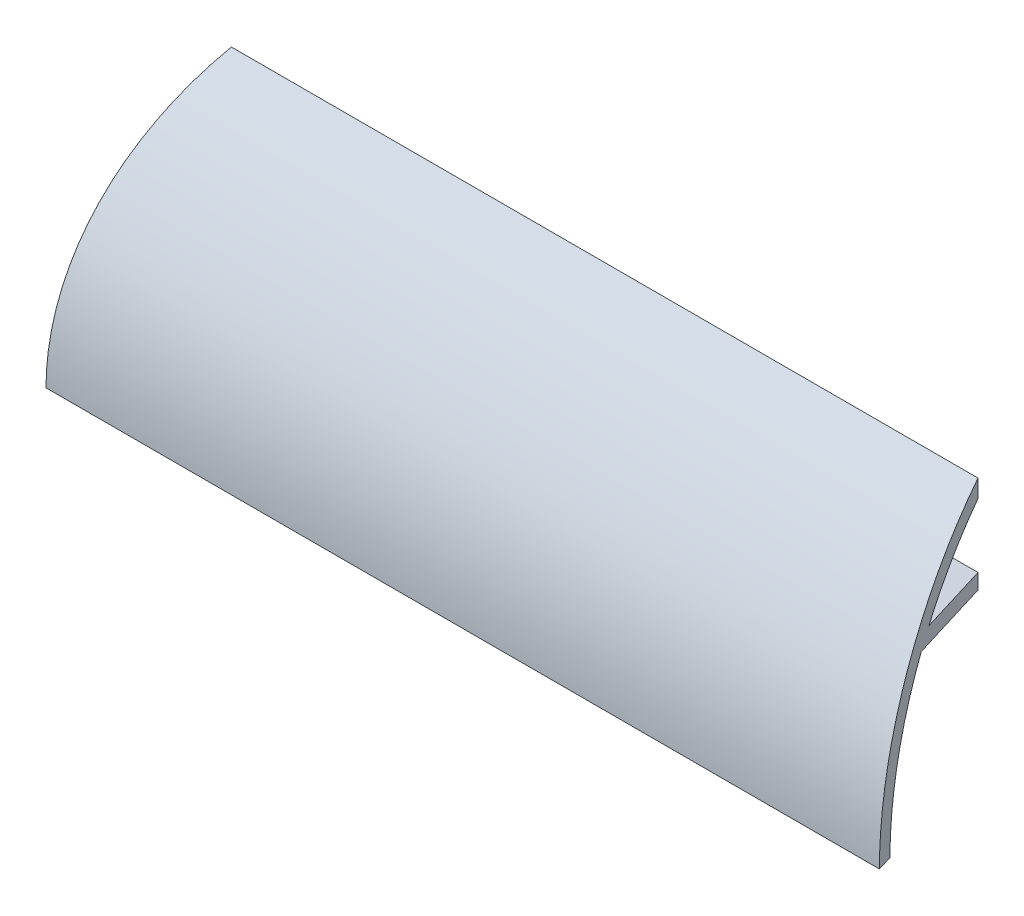
ISO-10303-21;
HEADER;
FILE_DESCRIPTION(('STEP AP214'),'2;1');
FILE_NAME('part.step','',(''),(''),'','','');
FILE_SCHEMA(('AUTOMOTIVE_DESIGN { 1 0 10303 214 1 1 1 1 }'));
ENDSEC;
DATA;
#1=APPLICATION_CONTEXT('core data for automotive mechanical design processes');
#2=APPLICATION_PROTOCOL_DEFINITION('international standard','automotive_design',2000,#1);
#3=PRODUCT_CONTEXT('',#1,'mechanical');
#4=PRODUCT('Part','Part','',(#3));
#5=PRODUCT_RELATED_PRODUCT_CATEGORY('part','',(#4));
#6=PRODUCT_DEFINITION_FORMATION('','',#4);
#7=PRODUCT_DEFINITION_CONTEXT('part definition',#1,'design');
#8=PRODUCT_DEFINITION('design','',#6,#7);
#9=PRODUCT_DEFINITION_SHAPE('','',#8);
#10=(LENGTH_UNIT() NAMED_UNIT(*) SI_UNIT(.MILLI.,.METRE.));
#11=(NAMED_UNIT(*) PLANE_ANGLE_UNIT() SI_UNIT($,.RADIAN.));
#12=(NAMED_UNIT(*) SI_UNIT($,.STERADIAN.) SOLID_ANGLE_UNIT());
#13=UNCERTAINTY_MEASURE_WITH_UNIT(LENGTH_MEASURE(1.E-05),#10,'distance_accuracy_value','');
#14=(GEOMETRIC_REPRESENTATION_CONTEXT(3) GLOBAL_UNCERTAINTY_ASSIGNED_CONTEXT((#13)) GLOBAL_UNIT_ASSIGNED_CONTEXT((#10,
#11,#12)) REPRESENTATION_CONTEXT('',''));
#15=CARTESIAN_POINT('',(0.,0.,0.));
#16=DIRECTION('',(0.,0.,1.));
#17=DIRECTION('',(1.,0.,0.));
#18=AXIS2_PLACEMENT_3D('',#15,#16,#17);
#19=CARTESIAN_POINT('',(13.15,0.,-4.48035714285714));
#20=DIRECTION('',(-1.,0.,0.));
#21=DIRECTION('',(0.,0.,1.));
#22=AXIS2_PLACEMENT_3D('',#19,#20,#21);
#23=CYLINDRICAL_SURFACE('',#22,4.48035714285714);
#24=DIRECTION('',(-1.,0.,0.));
#25=VECTOR('',#24,1.);
#26=CARTESIAN_POINT('',(13.15,3.88,-2.24));
#27=LINE('',#26,#25);
#28=CARTESIAN_POINT('',(12.4651632735326,3.88,-2.24));
#29=VERTEX_POINT('',#28);
#30=CARTESIAN_POINT('',(0.68483672646741,3.88,-2.24));
#31=VERTEX_POINT('',#30);
#32=EDGE_CURVE('E182',#29,#31,#27,.T.);
#33=ORIENTED_EDGE('',*,*,#32,.T.);
#34=CARTESIAN_POINT('',(1.36978264246391,0.,-4.48035714285714));
#35=DIRECTION('',(0.956304755963034,0.,0.292371704722741));
#36=DIRECTION('',(-0.292371704722741,0.,0.956304755963034));
#37=AXIS2_PLACEMENT_3D('',#34,#35,#36);
#38=ELLIPSE('',#37,4.68507253040403,4.48035714285714);
#39=CARTESIAN_POINT('',(0.,0.,0.));
#40=VERTEX_POINT('',#39);
#41=EDGE_CURVE('E121',#31,#40,#38,.T.);
#42=ORIENTED_EDGE('',*,*,#41,.T.);
#43=DIRECTION('',(-1.,0.,0.));
#44=VECTOR('',#43,1.);
#45=CARTESIAN_POINT('',(13.15,0.,0.));
#46=LINE('',#45,#44);
#47=CARTESIAN_POINT('',(13.15,0.,0.));
#48=VERTEX_POINT('',#47);
#49=EDGE_CURVE('E13',#48,#40,#46,.T.);
#50=ORIENTED_EDGE('',*,*,#49,.F.);
#51=CARTESIAN_POINT('',(11.7802173575361,0.,-4.48035714285714));
#52=DIRECTION('',(0.956304755963036,0.,-0.292371704722734));
#53=DIRECTION('',(-0.292371704722734,0.,-0.956304755963036));
#54=AXIS2_PLACEMENT_3D('',#51,#52,#53);
#55=ELLIPSE('',#54,4.68507253040402,4.48035714285714);
#56=EDGE_CURVE('E171',#29,#48,#55,.T.);
#57=ORIENTED_EDGE('',*,*,#56,.F.);
#58=EDGE_LOOP('',(#33,#42,#50,#57));
#59=FACE_BOUND('',#58,.T.);
#60=ADVANCED_FACE('F92',(#59),#23,.T.);
#61=CARTESIAN_POINT('',(13.15,0.,0.));
#62=DIRECTION('',(0.,1.,0.));
#63=DIRECTION('',(0.,0.,1.));
#64=AXIS2_PLACEMENT_3D('',#61,#62,#63);
#65=PLANE('',#64);
#66=ORIENTED_EDGE('',*,*,#49,.T.);
#67=DIRECTION('',(0.292371704722741,0.,-0.956304755963034));
#68=VECTOR('',#67,1.);
#69=CARTESIAN_POINT('',(1.12407796045063,0.,-3.67669334032021));
#70=LINE('',#69,#68);
#71=CARTESIAN_POINT('',(0.0733753635500795,0.,-0.24));
#72=VERTEX_POINT('',#71);
#73=EDGE_CURVE('E193',#40,#72,#70,.T.);
#74=ORIENTED_EDGE('',*,*,#73,.T.);
#75=DIRECTION('',(-1.,0.,0.));
#76=VECTOR('',#75,1.);
#77=CARTESIAN_POINT('',(13.15,0.,-0.24));
#78=LINE('',#77,#76);
#79=CARTESIAN_POINT('',(13.0766246364499,0.,-0.24));
#80=VERTEX_POINT('',#79);
#81=EDGE_CURVE('E100',#80,#72,#78,.T.);
#82=ORIENTED_EDGE('',*,*,#81,.F.);
#83=DIRECTION('',(-0.292371704722734,0.,-0.956304755963036));
#84=VECTOR('',#83,1.);
#85=CARTESIAN_POINT('',(13.15,0.,0.));
#86=LINE('',#85,#84);
#87=EDGE_CURVE('E174',#48,#80,#86,.T.);
#88=ORIENTED_EDGE('',*,*,#87,.F.);
#89=EDGE_LOOP('',(#66,#74,#82,#88));
#90=FACE_BOUND('',#89,.T.);
#91=ADVANCED_FACE('F186',(#90),#65,.F.);
#92=CARTESIAN_POINT('',(13.15,0.,-4.48035714285714));
#93=DIRECTION('',(-1.,0.,0.));
#94=DIRECTION('',(0.,0.,1.));
#95=AXIS2_PLACEMENT_3D('',#92,#93,#94);
#96=CYLINDRICAL_SURFACE('',#95,4.24035714285714);
#97=ORIENTED_EDGE('',*,*,#81,.T.);
#98=CARTESIAN_POINT('',(1.36978264246391,0.,-4.48035714285714));
#99=DIRECTION('',(0.956304755963034,0.,0.292371704722741));
#100=DIRECTION('',(-0.292371704722741,0.,0.956304755963034));
#101=AXIS2_PLACEMENT_3D('',#98,#99,#100);
#102=ELLIPSE('',#101,4.43410650884712,4.24035714285714);
#103=CARTESIAN_POINT('',(0.290673353750941,2.35,-0.950749700239819));
#104=VERTEX_POINT('',#103);
#105=EDGE_CURVE('E200',#72,#104,#102,.F.);
#106=ORIENTED_EDGE('',*,*,#105,.T.);
#107=DIRECTION('',(-1.,0.,0.));
#108=VECTOR('',#107,1.);
#109=CARTESIAN_POINT('',(13.15,2.35,-0.95074970023982));
#110=LINE('',#109,#108);
#111=CARTESIAN_POINT('',(12.8593266462491,2.35,-0.95074970023982));
#112=VERTEX_POINT('',#111);
#113=EDGE_CURVE('E234',#112,#104,#110,.T.);
#114=ORIENTED_EDGE('',*,*,#113,.F.);
#115=CARTESIAN_POINT('',(11.7802173575361,0.,-4.48035714285714));
#116=DIRECTION('',(0.956304755963036,0.,-0.292371704722734));
#117=DIRECTION('',(-0.292371704722734,0.,-0.956304755963036));
#118=AXIS2_PLACEMENT_3D('',#115,#116,#117);
#119=ELLIPSE('',#118,4.43410650884711,4.24035714285714);
#120=EDGE_CURVE('E190',#80,#112,#119,.F.);
#121=ORIENTED_EDGE('',*,*,#120,.F.);
#122=EDGE_LOOP('',(#97,#106,#114,#121));
#123=FACE_BOUND('',#122,.T.);
#124=ADVANCED_FACE('F240',(#123),#96,.F.);
#125=CARTESIAN_POINT('',(13.15,2.35,-0.95074970023982));
#126=DIRECTION('',(0.,1.,0.));
#127=DIRECTION('',(0.,0.,1.));
#128=AXIS2_PLACEMENT_3D('',#125,#126,#127);
#129=PLANE('',#128);
#130=ORIENTED_EDGE('',*,*,#113,.T.);
#131=DIRECTION('',(0.292371704722741,0.,-0.956304755963034));
#132=VECTOR('',#131,1.);
#133=CARTESIAN_POINT('',(1.38990420312616,2.35,-4.54617180223724));
#134=LINE('',#133,#132);
#135=CARTESIAN_POINT('',(0.68483672646741,2.35,-2.24));
#136=VERTEX_POINT('',#135);
#137=EDGE_CURVE('E248',#104,#136,#134,.T.);
#138=ORIENTED_EDGE('',*,*,#137,.T.);
#139=DIRECTION('',(-1.,0.,0.));
#140=VECTOR('',#139,1.);
#141=CARTESIAN_POINT('',(13.15,2.35,-2.24));
#142=LINE('',#141,#140);
#143=CARTESIAN_POINT('',(12.4651632735326,2.35,-2.24));
#144=VERTEX_POINT('',#143);
#145=EDGE_CURVE('E230',#144,#136,#142,.T.);
#146=ORIENTED_EDGE('',*,*,#145,.F.);
#147=DIRECTION('',(-0.292371704722734,0.,-0.956304755963036));
#148=VECTOR('',#147,1.);
#149=CARTESIAN_POINT('',(12.8841737573245,2.35,-0.869478461917038));
#150=LINE('',#149,#148);
#151=EDGE_CURVE('E212',#112,#144,#150,.T.);
#152=ORIENTED_EDGE('',*,*,#151,.F.);
#153=EDGE_LOOP('',(#130,#138,#146,#152));
#154=FACE_BOUND('',#153,.T.);
#155=ADVANCED_FACE('F246',(#154),#129,.F.);
#156=CARTESIAN_POINT('',(13.15,2.35,-2.24));
#157=DIRECTION('',(0.,0.,1.));
#158=DIRECTION('',(1.,0.,0.));
#159=AXIS2_PLACEMENT_3D('',#156,#157,#158);
#160=PLANE('',#159);
#161=ORIENTED_EDGE('',*,*,#145,.T.);
#162=DIRECTION('',(0.,1.,0.));
#163=VECTOR('',#162,1.);
#164=CARTESIAN_POINT('',(0.68483672646741,2.35,-2.24));
#165=LINE('',#164,#163);
#166=CARTESIAN_POINT('',(0.684836726467408,2.59,-2.24));
#167=VERTEX_POINT('',#166);
#168=EDGE_CURVE('E253',#136,#167,#165,.T.);
#169=ORIENTED_EDGE('',*,*,#168,.T.);
#170=DIRECTION('',(-1.,0.,0.));
#171=VECTOR('',#170,1.);
#172=CARTESIAN_POINT('',(13.15,2.59,-2.24));
#173=LINE('',#172,#171);
#174=CARTESIAN_POINT('',(12.4651632735326,2.59,-2.24));
#175=VERTEX_POINT('',#174);
#176=EDGE_CURVE('E226',#175,#167,#173,.T.);
#177=ORIENTED_EDGE('',*,*,#176,.F.);
#178=DIRECTION('',(0.,1.,0.));
#179=VECTOR('',#178,1.);
#180=CARTESIAN_POINT('',(12.4651632735326,2.35,-2.24));
#181=LINE('',#180,#179);
#182=EDGE_CURVE('E209',#144,#175,#181,.T.);
#183=ORIENTED_EDGE('',*,*,#182,.F.);
#184=EDGE_LOOP('',(#161,#169,#177,#183));
#185=FACE_BOUND('',#184,.T.);
#186=ADVANCED_FACE('F251',(#185),#160,.F.);
#187=CARTESIAN_POINT('',(13.15,2.59,-2.24));
#188=DIRECTION('',(0.,-1.,0.));
#189=DIRECTION('',(0.,0.,-1.));
#190=AXIS2_PLACEMENT_3D('',#187,#188,#189);
#191=PLANE('',#190);
#192=ORIENTED_EDGE('',*,*,#176,.T.);
#193=DIRECTION('',(-0.292371704722741,0.,0.956304755963034));
#194=VECTOR('',#193,1.);
#195=CARTESIAN_POINT('',(1.75037401233787,2.59,-5.72521542158185));
#196=LINE('',#195,#194);
#197=CARTESIAN_POINT('',(0.343304516307088,2.59,-1.12289847610045));
#198=VERTEX_POINT('',#197);
#199=EDGE_CURVE('E259',#167,#198,#196,.T.);
#200=ORIENTED_EDGE('',*,*,#199,.T.);
#201=DIRECTION('',(-1.,0.,0.));
#202=VECTOR('',#201,1.);
#203=CARTESIAN_POINT('',(13.15,2.59,-1.12289847610045));
#204=LINE('',#203,#202);
#205=CARTESIAN_POINT('',(12.8066954836929,2.59,-1.12289847610045));
#206=VERTEX_POINT('',#205);
#207=EDGE_CURVE('E222',#206,#198,#204,.T.);
#208=ORIENTED_EDGE('',*,*,#207,.F.);
#209=DIRECTION('',(0.292371704722734,0.,0.956304755963036));
#210=VECTOR('',#209,1.);
#211=CARTESIAN_POINT('',(12.5237039481128,2.59,-2.04852208126165));
#212=LINE('',#211,#210);
#213=EDGE_CURVE('E206',#175,#206,#212,.T.);
#214=ORIENTED_EDGE('',*,*,#213,.F.);
#215=EDGE_LOOP('',(#192,#200,#208,#214));
#216=FACE_BOUND('',#215,.T.);
#217=ADVANCED_FACE('F257',(#216),#191,.F.);
#218=CARTESIAN_POINT('',(13.15,0.,-4.48035714285714));
#219=DIRECTION('',(-1.,0.,0.));
#220=DIRECTION('',(0.,0.,1.));
#221=AXIS2_PLACEMENT_3D('',#218,#219,#220);
#222=CYLINDRICAL_SURFACE('',#221,4.24035714285714);
#223=ORIENTED_EDGE('',*,*,#207,.T.);
#224=CARTESIAN_POINT('',(1.36978264246391,0.,-4.48035714285714));
#225=DIRECTION('',(0.956304755963034,0.,0.292371704722741));
#226=DIRECTION('',(-0.292371704722741,0.,0.956304755963034));
#227=AXIS2_PLACEMENT_3D('',#224,#225,#226);
#228=ELLIPSE('',#227,4.43410650884712,4.24035714285714);
#229=CARTESIAN_POINT('',(0.68483672646741,3.60019840723099,-2.24));
#230=VERTEX_POINT('',#229);
#231=EDGE_CURVE('E264',#198,#230,#228,.F.);
#232=ORIENTED_EDGE('',*,*,#231,.T.);
#233=DIRECTION('',(-1.,0.,0.));
#234=VECTOR('',#233,1.);
#235=CARTESIAN_POINT('',(13.15,3.60019840723099,-2.24));
#236=LINE('',#235,#234);
#237=CARTESIAN_POINT('',(12.4651632735326,3.60019840723099,-2.24));
#238=VERTEX_POINT('',#237);
#239=EDGE_CURVE('E218',#238,#230,#236,.T.);
#240=ORIENTED_EDGE('',*,*,#239,.F.);
#241=CARTESIAN_POINT('',(11.7802173575361,0.,-4.48035714285714));
#242=DIRECTION('',(0.956304755963036,0.,-0.292371704722734));
#243=DIRECTION('',(-0.292371704722734,0.,-0.956304755963036));
#244=AXIS2_PLACEMENT_3D('',#241,#242,#243);
#245=ELLIPSE('',#244,4.43410650884711,4.24035714285714);
#246=EDGE_CURVE('E110',#206,#238,#245,.F.);
#247=ORIENTED_EDGE('',*,*,#246,.F.);
#248=EDGE_LOOP('',(#223,#232,#240,#247));
#249=FACE_BOUND('',#248,.T.);
#250=ADVANCED_FACE('F262',(#249),#222,.F.);
#251=CARTESIAN_POINT('',(13.15,3.60019840723099,-2.24));
#252=DIRECTION('',(0.,0.,1.));
#253=DIRECTION('',(0.,-1.,0.));
#254=AXIS2_PLACEMENT_3D('',#251,#252,#253);
#255=PLANE('',#254);
#256=ORIENTED_EDGE('',*,*,#239,.T.);
#257=DIRECTION('',(0.,1.,0.));
#258=VECTOR('',#257,1.);
#259=CARTESIAN_POINT('',(0.68483672646741,3.600198407231,-2.24));
#260=LINE('',#259,#258);
#261=EDGE_CURVE('E267',#230,#31,#260,.T.);
#262=ORIENTED_EDGE('',*,*,#261,.T.);
#263=ORIENTED_EDGE('',*,*,#32,.F.);
#264=DIRECTION('',(0.,1.,0.));
#265=VECTOR('',#264,1.);
#266=CARTESIAN_POINT('',(12.4651632735326,3.60019840723099,-2.24));
#267=LINE('',#266,#265);
#268=EDGE_CURVE('E176',#238,#29,#267,.T.);
#269=ORIENTED_EDGE('',*,*,#268,.F.);
#270=EDGE_LOOP('',(#256,#262,#263,#269));
#271=FACE_BOUND('',#270,.T.);
#272=ADVANCED_FACE('F266',(#271),#255,.F.);
#273=CARTESIAN_POINT('',(12.232807955624,3.88,-3.));
#274=DIRECTION('',(0.956304755963036,0.,-0.292371704722734));
#275=DIRECTION('',(-0.292371704722734,0.,-0.956304755963036));
#276=AXIS2_PLACEMENT_3D('',#273,#274,#275);
#277=PLANE('',#276);
#278=ORIENTED_EDGE('',*,*,#56,.T.);
#279=ORIENTED_EDGE('',*,*,#87,.T.);
#280=ORIENTED_EDGE('',*,*,#120,.T.);
#281=ORIENTED_EDGE('',*,*,#151,.T.);
#282=ORIENTED_EDGE('',*,*,#182,.T.);
#283=ORIENTED_EDGE('',*,*,#213,.T.);
#284=ORIENTED_EDGE('',*,*,#246,.T.);
#285=ORIENTED_EDGE('',*,*,#268,.T.);
#286=EDGE_LOOP('',(#278,#279,#280,#281,#282,#283,#284,#285));
#287=FACE_BOUND('',#286,.T.);
#288=ADVANCED_FACE('F173',(#287),#277,.T.);
#289=CARTESIAN_POINT('',(0.917192044375994,3.88,-3.));
#290=DIRECTION('',(0.956304755963034,0.,0.292371704722741));
#291=DIRECTION('',(0.292371704722741,0.,-0.956304755963034));
#292=AXIS2_PLACEMENT_3D('',#289,#290,#291);
#293=PLANE('',#292);
#294=ORIENTED_EDGE('',*,*,#261,.F.);
#295=ORIENTED_EDGE('',*,*,#231,.F.);
#296=ORIENTED_EDGE('',*,*,#199,.F.);
#297=ORIENTED_EDGE('',*,*,#168,.F.);
#298=ORIENTED_EDGE('',*,*,#137,.F.);
#299=ORIENTED_EDGE('',*,*,#105,.F.);
#300=ORIENTED_EDGE('',*,*,#73,.F.);
#301=ORIENTED_EDGE('',*,*,#41,.F.);
#302=EDGE_LOOP('',(#294,#295,#296,#297,#298,#299,#300,#301));
#303=FACE_BOUND('',#302,.T.);
#304=ADVANCED_FACE('F278',(#303),#293,.F.);
#305=CLOSED_SHELL('',(#60,#91,#124,#155,#186,#217,#250,#272,#288,#304));
#306=MANIFOLD_SOLID_BREP('B2',#305);
#307=ADVANCED_BREP_SHAPE_REPRESENTATION('',(#18,#306),#14);
#308=SHAPE_DEFINITION_REPRESENTATION(#9,#307);
ENDSEC;
END-ISO-10303-21;
